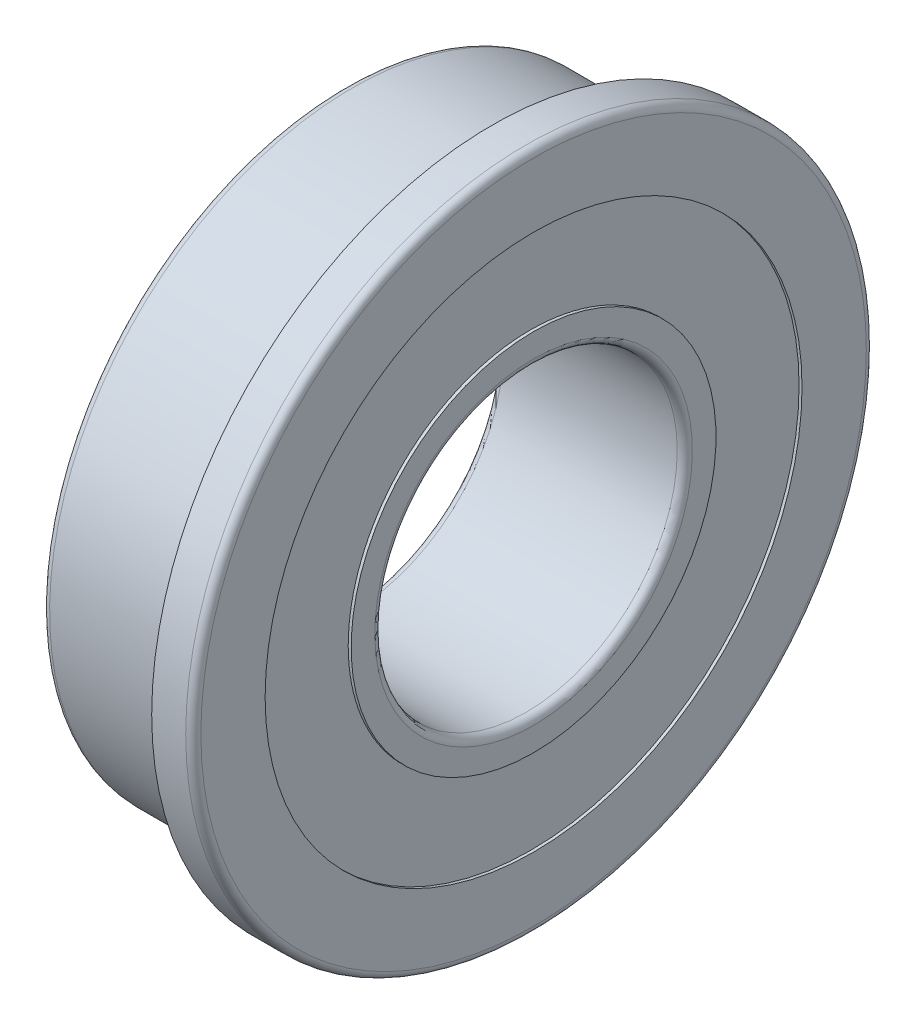
ISO-10303-21;
HEADER;
FILE_DESCRIPTION(('STEP AP214'),'2;1');
FILE_NAME('part.step','',(''),(''),'','','');
FILE_SCHEMA(('AUTOMOTIVE_DESIGN { 1 0 10303 214 1 1 1 1 }'));
ENDSEC;
DATA;
#1=APPLICATION_CONTEXT('core data for automotive mechanical design processes');
#2=APPLICATION_PROTOCOL_DEFINITION('international standard','automotive_design',2000,#1);
#3=PRODUCT_CONTEXT('',#1,'mechanical');
#4=PRODUCT('Part','Part','',(#3));
#5=PRODUCT_RELATED_PRODUCT_CATEGORY('part','',(#4));
#6=PRODUCT_DEFINITION_FORMATION('','',#4);
#7=PRODUCT_DEFINITION_CONTEXT('part definition',#1,'design');
#8=PRODUCT_DEFINITION('design','',#6,#7);
#9=PRODUCT_DEFINITION_SHAPE('','',#8);
#10=(LENGTH_UNIT() NAMED_UNIT(*) SI_UNIT(.MILLI.,.METRE.));
#11=(NAMED_UNIT(*) PLANE_ANGLE_UNIT() SI_UNIT($,.RADIAN.));
#12=(NAMED_UNIT(*) SI_UNIT($,.STERADIAN.) SOLID_ANGLE_UNIT());
#13=UNCERTAINTY_MEASURE_WITH_UNIT(LENGTH_MEASURE(1.E-05),#10,'distance_accuracy_value','');
#14=(GEOMETRIC_REPRESENTATION_CONTEXT(3) GLOBAL_UNCERTAINTY_ASSIGNED_CONTEXT((#13)) GLOBAL_UNIT_ASSIGNED_CONTEXT((#10,
#11,#12)) REPRESENTATION_CONTEXT('',''));
#15=CARTESIAN_POINT('',(0.,0.,0.));
#16=DIRECTION('',(0.,0.,1.));
#17=DIRECTION('',(1.,0.,0.));
#18=AXIS2_PLACEMENT_3D('',#15,#16,#17);
#19=CARTESIAN_POINT('',(4.6875,7.1,0.));
#20=DIRECTION('',(-1.,0.,0.));
#21=DIRECTION('',(0.,0.,1.));
#22=AXIS2_PLACEMENT_3D('',#19,#20,#21);
#23=PLANE('',#22);
#24=CARTESIAN_POINT('',(4.6875,0.,0.));
#25=DIRECTION('',(1.,0.,0.));
#26=DIRECTION('',(0.,0.,-1.));
#27=AXIS2_PLACEMENT_3D('',#24,#25,#26);
#28=CIRCLE('',#27,4.825);
#29=CARTESIAN_POINT('',(4.6875,0.,-4.825));
#30=VERTEX_POINT('',#29);
#31=EDGE_CURVE('P0_E10',#30,#30,#28,.T.);
#32=ORIENTED_EDGE('',*,*,#31,.T.);
#33=EDGE_LOOP('',(#32));
#34=FACE_BOUND('',#33,.T.);
#35=CARTESIAN_POINT('',(4.6875,0.,0.));
#36=DIRECTION('',(1.,0.,0.));
#37=DIRECTION('',(0.,0.,-1.));
#38=AXIS2_PLACEMENT_3D('',#35,#36,#37);
#39=CIRCLE('',#38,7.1);
#40=CARTESIAN_POINT('',(4.6875,0.,-7.1));
#41=VERTEX_POINT('',#40);
#42=EDGE_CURVE('P0_E23',#41,#41,#39,.T.);
#43=ORIENTED_EDGE('',*,*,#42,.F.);
#44=EDGE_LOOP('',(#43));
#45=FACE_BOUND('',#44,.T.);
#46=ADVANCED_FACE('P0_F15',(#34,#45),#23,.T.);
#47=CARTESIAN_POINT('',(4.92175,0.,0.));
#48=DIRECTION('',(1.,0.,0.));
#49=DIRECTION('',(0.,0.,-1.));
#50=AXIS2_PLACEMENT_3D('',#47,#48,#49);
#51=CYLINDRICAL_SURFACE('',#50,7.1);
#52=ORIENTED_EDGE('',*,*,#42,.T.);
#53=EDGE_LOOP('',(#52));
#54=FACE_BOUND('',#53,.T.);
#55=CARTESIAN_POINT('',(4.92175,0.,0.));
#56=DIRECTION('',(1.,0.,0.));
#57=DIRECTION('',(0.,0.,-1.));
#58=AXIS2_PLACEMENT_3D('',#55,#56,#57);
#59=CIRCLE('',#58,7.1);
#60=CARTESIAN_POINT('',(4.92175,0.,-7.1));
#61=VERTEX_POINT('',#60);
#62=EDGE_CURVE('P0_E41',#61,#61,#59,.T.);
#63=ORIENTED_EDGE('',*,*,#62,.F.);
#64=EDGE_LOOP('',(#63));
#65=FACE_BOUND('',#64,.T.);
#66=ADVANCED_FACE('P0_F53',(#54,#65),#51,.T.);
#67=CARTESIAN_POINT('',(4.92175,4.825,0.));
#68=DIRECTION('',(1.,0.,0.));
#69=DIRECTION('',(0.,0.,-1.));
#70=AXIS2_PLACEMENT_3D('',#67,#68,#69);
#71=PLANE('',#70);
#72=ORIENTED_EDGE('',*,*,#62,.T.);
#73=EDGE_LOOP('',(#72));
#74=FACE_BOUND('',#73,.T.);
#75=CARTESIAN_POINT('',(4.92175,0.,0.));
#76=DIRECTION('',(1.,0.,0.));
#77=DIRECTION('',(0.,0.,-1.));
#78=AXIS2_PLACEMENT_3D('',#75,#76,#77);
#79=CIRCLE('',#78,4.825);
#80=CARTESIAN_POINT('',(4.92175,0.,-4.825));
#81=VERTEX_POINT('',#80);
#82=EDGE_CURVE('P0_E38',#81,#81,#79,.T.);
#83=ORIENTED_EDGE('',*,*,#82,.F.);
#84=EDGE_LOOP('',(#83));
#85=FACE_BOUND('',#84,.T.);
#86=ADVANCED_FACE('P0_F39',(#74,#85),#71,.T.);
#87=CARTESIAN_POINT('',(4.92175,0.,0.));
#88=DIRECTION('',(1.,0.,0.));
#89=DIRECTION('',(0.,0.,-1.));
#90=AXIS2_PLACEMENT_3D('',#87,#88,#89);
#91=CYLINDRICAL_SURFACE('',#90,4.825);
#92=ORIENTED_EDGE('',*,*,#82,.T.);
#93=EDGE_LOOP('',(#92));
#94=FACE_BOUND('',#93,.T.);
#95=ORIENTED_EDGE('',*,*,#31,.F.);
#96=EDGE_LOOP('',(#95));
#97=FACE_BOUND('',#96,.T.);
#98=ADVANCED_FACE('P0_F58',(#94,#97),#91,.F.);
#99=CLOSED_SHELL('',(#46,#66,#86,#98));
#100=MANIFOLD_SOLID_BREP('P0_B1',#99);
#101=CARTESIAN_POINT('',(0.3125,0.,-7.1));
#102=DIRECTION('',(1.,0.,0.));
#103=DIRECTION('',(0.,-1.,0.));
#104=AXIS2_PLACEMENT_3D('',#101,#102,#103);
#105=PLANE('',#104);
#106=CARTESIAN_POINT('',(0.3125,0.,0.));
#107=DIRECTION('',(-1.,0.,0.));
#108=DIRECTION('',(0.,1.,0.));
#109=AXIS2_PLACEMENT_3D('',#106,#107,#108);
#110=CIRCLE('',#109,4.825);
#111=CARTESIAN_POINT('',(0.3125,4.825,0.));
#112=VERTEX_POINT('',#111);
#113=EDGE_CURVE('P1_E11',#112,#112,#110,.T.);
#114=ORIENTED_EDGE('',*,*,#113,.T.);
#115=EDGE_LOOP('',(#114));
#116=FACE_BOUND('',#115,.T.);
#117=CARTESIAN_POINT('',(0.3125,0.,0.));
#118=DIRECTION('',(-1.,0.,0.));
#119=DIRECTION('',(0.,1.,0.));
#120=AXIS2_PLACEMENT_3D('',#117,#118,#119);
#121=CIRCLE('',#120,7.1);
#122=CARTESIAN_POINT('',(0.3125,7.1,0.));
#123=VERTEX_POINT('',#122);
#124=EDGE_CURVE('P1_E24',#123,#123,#121,.T.);
#125=ORIENTED_EDGE('',*,*,#124,.F.);
#126=EDGE_LOOP('',(#125));
#127=FACE_BOUND('',#126,.T.);
#128=ADVANCED_FACE('P1_F16',(#116,#127),#105,.T.);
#129=CARTESIAN_POINT('',(0.07825,0.,0.));
#130=DIRECTION('',(-1.,0.,0.));
#131=DIRECTION('',(0.,1.,0.));
#132=AXIS2_PLACEMENT_3D('',#129,#130,#131);
#133=CYLINDRICAL_SURFACE('',#132,7.1);
#134=ORIENTED_EDGE('',*,*,#124,.T.);
#135=EDGE_LOOP('',(#134));
#136=FACE_BOUND('',#135,.T.);
#137=CARTESIAN_POINT('',(0.07825,0.,0.));
#138=DIRECTION('',(-1.,0.,0.));
#139=DIRECTION('',(0.,1.,0.));
#140=AXIS2_PLACEMENT_3D('',#137,#138,#139);
#141=CIRCLE('',#140,7.1);
#142=CARTESIAN_POINT('',(0.07825,7.1,0.));
#143=VERTEX_POINT('',#142);
#144=EDGE_CURVE('P1_E42',#143,#143,#141,.T.);
#145=ORIENTED_EDGE('',*,*,#144,.F.);
#146=EDGE_LOOP('',(#145));
#147=FACE_BOUND('',#146,.T.);
#148=ADVANCED_FACE('P1_F54',(#136,#147),#133,.T.);
#149=CARTESIAN_POINT('',(0.07825,0.,-4.825));
#150=DIRECTION('',(-1.,0.,0.));
#151=DIRECTION('',(0.,1.,0.));
#152=AXIS2_PLACEMENT_3D('',#149,#150,#151);
#153=PLANE('',#152);
#154=ORIENTED_EDGE('',*,*,#144,.T.);
#155=EDGE_LOOP('',(#154));
#156=FACE_BOUND('',#155,.T.);
#157=CARTESIAN_POINT('',(0.07825,0.,0.));
#158=DIRECTION('',(-1.,0.,0.));
#159=DIRECTION('',(0.,1.,0.));
#160=AXIS2_PLACEMENT_3D('',#157,#158,#159);
#161=CIRCLE('',#160,4.825);
#162=CARTESIAN_POINT('',(0.07825,4.825,0.));
#163=VERTEX_POINT('',#162);
#164=EDGE_CURVE('P1_E39',#163,#163,#161,.T.);
#165=ORIENTED_EDGE('',*,*,#164,.F.);
#166=EDGE_LOOP('',(#165));
#167=FACE_BOUND('',#166,.T.);
#168=ADVANCED_FACE('P1_F40',(#156,#167),#153,.T.);
#169=CARTESIAN_POINT('',(0.07825,0.,0.));
#170=DIRECTION('',(-1.,0.,0.));
#171=DIRECTION('',(0.,1.,0.));
#172=AXIS2_PLACEMENT_3D('',#169,#170,#171);
#173=CYLINDRICAL_SURFACE('',#172,4.825);
#174=ORIENTED_EDGE('',*,*,#164,.T.);
#175=EDGE_LOOP('',(#174));
#176=FACE_BOUND('',#175,.T.);
#177=ORIENTED_EDGE('',*,*,#113,.F.);
#178=EDGE_LOOP('',(#177));
#179=FACE_BOUND('',#178,.T.);
#180=ADVANCED_FACE('P1_F59',(#176,#179),#173,.F.);
#181=CLOSED_SHELL('',(#128,#148,#168,#180));
#182=MANIFOLD_SOLID_BREP('P1_B1',#181);
#183=CARTESIAN_POINT('',(0.,7.8,0.));
#184=DIRECTION('',(-1.,0.,0.));
#185=DIRECTION('',(0.,0.,1.));
#186=AXIS2_PLACEMENT_3D('',#183,#184,#185);
#187=PLANE('',#186);
#188=CARTESIAN_POINT('',(0.,0.,0.));
#189=DIRECTION('',(1.,0.,0.));
#190=DIRECTION('',(0.,0.,-1.));
#191=AXIS2_PLACEMENT_3D('',#188,#189,#190);
#192=CIRCLE('',#191,7.1);
#193=CARTESIAN_POINT('',(0.,0.,-7.1));
#194=VERTEX_POINT('',#193);
#195=EDGE_CURVE('P2_E11',#194,#194,#192,.T.);
#196=ORIENTED_EDGE('',*,*,#195,.T.);
#197=EDGE_LOOP('',(#196));
#198=FACE_BOUND('',#197,.T.);
#199=CARTESIAN_POINT('',(0.,0.,0.));
#200=DIRECTION('',(1.,0.,0.));
#201=DIRECTION('',(0.,0.,-1.));
#202=AXIS2_PLACEMENT_3D('',#199,#200,#201);
#203=CIRCLE('',#202,7.8);
#204=CARTESIAN_POINT('',(0.,-4.58472496788129,6.31033255612459));
#205=VERTEX_POINT('',#204);
#206=CARTESIAN_POINT('',(0.,0.,-7.8));
#207=VERTEX_POINT('',#206);
#208=EDGE_CURVE('P2_E24',#205,#207,#203,.T.);
#209=ORIENTED_EDGE('',*,*,#208,.F.);
#210=CARTESIAN_POINT('',(0.,0.,0.));
#211=DIRECTION('',(1.,0.,0.));
#212=DIRECTION('',(0.,0.,-1.));
#213=AXIS2_PLACEMENT_3D('',#210,#211,#212);
#214=CIRCLE('',#213,7.8);
#215=CARTESIAN_POINT('',(0.,7.4182408271022,2.41033255612459));
#216=VERTEX_POINT('',#215);
#217=EDGE_CURVE('P2_E221',#216,#205,#214,.T.);
#218=ORIENTED_EDGE('',*,*,#217,.F.);
#219=CARTESIAN_POINT('',(0.,0.,0.));
#220=DIRECTION('',(1.,0.,0.));
#221=DIRECTION('',(0.,0.,-1.));
#222=AXIS2_PLACEMENT_3D('',#219,#220,#221);
#223=CIRCLE('',#222,7.8);
#224=EDGE_CURVE('P2_E216',#207,#216,#223,.T.);
#225=ORIENTED_EDGE('',*,*,#224,.F.);
#226=EDGE_LOOP('',(#209,#218,#225));
#227=FACE_BOUND('',#226,.T.);
#228=ADVANCED_FACE('P2_F16',(#198,#227),#187,.T.);
#229=CARTESIAN_POINT('',(0.200000000000015,0.,0.));
#230=DIRECTION('',(1.,0.,0.));
#231=DIRECTION('',(0.,-0.587785252292473,0.809016994374948));
#232=AXIS2_PLACEMENT_3D('',#229,#230,#231);
#233=TOROIDAL_SURFACE('',#232,7.8,0.200000000000014);
#234=ORIENTED_EDGE('',*,*,#224,.T.);
#235=ORIENTED_EDGE('',*,*,#217,.T.);
#236=ORIENTED_EDGE('',*,*,#208,.T.);
#237=EDGE_LOOP('',(#234,#235,#236));
#238=FACE_BOUND('',#237,.T.);
#239=CARTESIAN_POINT('',(0.2,0.,0.));
#240=DIRECTION('',(1.,0.,0.));
#241=DIRECTION('',(0.,0.,-1.));
#242=AXIS2_PLACEMENT_3D('',#239,#240,#241);
#243=CIRCLE('',#242,8.);
#244=CARTESIAN_POINT('',(0.2,7.60845213036124,2.47213595499958));
#245=VERTEX_POINT('',#244);
#246=CARTESIAN_POINT('',(0.199999999999999,-4.70228201833979,6.47213595499959));
#247=VERTEX_POINT('',#246);
#248=EDGE_CURVE('P2_E211',#245,#247,#243,.T.);
#249=ORIENTED_EDGE('',*,*,#248,.F.);
#250=CARTESIAN_POINT('',(0.2,0.,0.));
#251=DIRECTION('',(1.,0.,0.));
#252=DIRECTION('',(0.,0.,-1.));
#253=AXIS2_PLACEMENT_3D('',#250,#251,#252);
#254=CIRCLE('',#253,8.);
#255=CARTESIAN_POINT('',(0.2,0.,-8.));
#256=VERTEX_POINT('',#255);
#257=EDGE_CURVE('P2_E206',#256,#245,#254,.T.);
#258=ORIENTED_EDGE('',*,*,#257,.F.);
#259=CARTESIAN_POINT('',(0.2,0.,0.));
#260=DIRECTION('',(1.,0.,0.));
#261=DIRECTION('',(0.,0.,-1.));
#262=AXIS2_PLACEMENT_3D('',#259,#260,#261);
#263=CIRCLE('',#262,8.);
#264=EDGE_CURVE('P2_E201',#247,#256,#263,.T.);
#265=ORIENTED_EDGE('',*,*,#264,.F.);
#266=EDGE_LOOP('',(#249,#258,#265));
#267=FACE_BOUND('',#266,.T.);
#268=ADVANCED_FACE('P2_F230',(#238,#267),#233,.T.);
#269=CARTESIAN_POINT('',(5.,0.,0.));
#270=DIRECTION('',(1.,0.,0.));
#271=DIRECTION('',(0.,0.,-1.));
#272=AXIS2_PLACEMENT_3D('',#269,#270,#271);
#273=CYLINDRICAL_SURFACE('',#272,8.);
#274=ORIENTED_EDGE('',*,*,#257,.T.);
#275=ORIENTED_EDGE('',*,*,#248,.T.);
#276=ORIENTED_EDGE('',*,*,#264,.T.);
#277=EDGE_LOOP('',(#274,#275,#276));
#278=FACE_BOUND('',#277,.T.);
#279=CARTESIAN_POINT('',(3.9,0.,0.));
#280=DIRECTION('',(1.,0.,0.));
#281=DIRECTION('',(0.,0.,-1.));
#282=AXIS2_PLACEMENT_3D('',#279,#280,#281);
#283=CIRCLE('',#282,8.);
#284=CARTESIAN_POINT('',(3.9,0.,-8.));
#285=VERTEX_POINT('',#284);
#286=EDGE_CURVE('P2_E196',#285,#285,#283,.T.);
#287=ORIENTED_EDGE('',*,*,#286,.F.);
#288=EDGE_LOOP('',(#287));
#289=FACE_BOUND('',#288,.T.);
#290=ADVANCED_FACE('P2_F237',(#278,#289),#273,.T.);
#291=CARTESIAN_POINT('',(3.9,9.,0.));
#292=DIRECTION('',(-1.,0.,0.));
#293=DIRECTION('',(0.,0.,1.));
#294=AXIS2_PLACEMENT_3D('',#291,#292,#293);
#295=PLANE('',#294);
#296=ORIENTED_EDGE('',*,*,#286,.T.);
#297=EDGE_LOOP('',(#296));
#298=FACE_BOUND('',#297,.T.);
#299=CARTESIAN_POINT('',(3.9,0.,0.));
#300=DIRECTION('',(1.,0.,0.));
#301=DIRECTION('',(0.,0.,-1.));
#302=AXIS2_PLACEMENT_3D('',#299,#300,#301);
#303=CIRCLE('',#302,9.);
#304=CARTESIAN_POINT('',(3.9,0.,-9.));
#305=VERTEX_POINT('',#304);
#306=EDGE_CURVE('P2_E191',#305,#305,#303,.T.);
#307=ORIENTED_EDGE('',*,*,#306,.F.);
#308=EDGE_LOOP('',(#307));
#309=FACE_BOUND('',#308,.T.);
#310=ADVANCED_FACE('P2_F241',(#298,#309),#295,.T.);
#311=CARTESIAN_POINT('',(5.,0.,0.));
#312=DIRECTION('',(1.,0.,0.));
#313=DIRECTION('',(0.,0.,-1.));
#314=AXIS2_PLACEMENT_3D('',#311,#312,#313);
#315=CYLINDRICAL_SURFACE('',#314,9.);
#316=ORIENTED_EDGE('',*,*,#306,.T.);
#317=EDGE_LOOP('',(#316));
#318=FACE_BOUND('',#317,.T.);
#319=CARTESIAN_POINT('',(4.8,0.,0.));
#320=DIRECTION('',(1.,0.,0.));
#321=DIRECTION('',(0.,0.,-1.));
#322=AXIS2_PLACEMENT_3D('',#319,#320,#321);
#323=CIRCLE('',#322,9.);
#324=CARTESIAN_POINT('',(4.8,-5.29006727063228,7.28115294937456));
#325=VERTEX_POINT('',#324);
#326=CARTESIAN_POINT('',(4.8,0.,-9.));
#327=VERTEX_POINT('',#326);
#328=EDGE_CURVE('P2_E186',#325,#327,#323,.T.);
#329=ORIENTED_EDGE('',*,*,#328,.F.);
#330=CARTESIAN_POINT('',(4.8,0.,0.));
#331=DIRECTION('',(1.,0.,0.));
#332=DIRECTION('',(0.,0.,-1.));
#333=AXIS2_PLACEMENT_3D('',#330,#331,#332);
#334=CIRCLE('',#333,9.);
#335=CARTESIAN_POINT('',(4.8,8.55950864665642,2.78115294937454));
#336=VERTEX_POINT('',#335);
#337=EDGE_CURVE('P2_E181',#336,#325,#334,.T.);
#338=ORIENTED_EDGE('',*,*,#337,.F.);
#339=CARTESIAN_POINT('',(4.8,0.,0.));
#340=DIRECTION('',(1.,0.,0.));
#341=DIRECTION('',(0.,0.,-1.));
#342=AXIS2_PLACEMENT_3D('',#339,#340,#341);
#343=CIRCLE('',#342,9.);
#344=EDGE_CURVE('P2_E176',#327,#336,#343,.T.);
#345=ORIENTED_EDGE('',*,*,#344,.F.);
#346=EDGE_LOOP('',(#329,#338,#345));
#347=FACE_BOUND('',#346,.T.);
#348=ADVANCED_FACE('P2_F247',(#318,#347),#315,.T.);
#349=CARTESIAN_POINT('',(4.8,0.,0.));
#350=DIRECTION('',(1.,0.,0.));
#351=DIRECTION('',(0.,-0.587785252292473,0.809016994374948));
#352=AXIS2_PLACEMENT_3D('',#349,#350,#351);
#353=TOROIDAL_SURFACE('',#352,8.8,0.200000000000034);
#354=ORIENTED_EDGE('',*,*,#344,.T.);
#355=ORIENTED_EDGE('',*,*,#337,.T.);
#356=ORIENTED_EDGE('',*,*,#328,.T.);
#357=EDGE_LOOP('',(#354,#355,#356));
#358=FACE_BOUND('',#357,.T.);
#359=CARTESIAN_POINT('',(5.,0.,0.));
#360=DIRECTION('',(1.,0.,0.));
#361=DIRECTION('',(0.,0.,-1.));
#362=AXIS2_PLACEMENT_3D('',#359,#360,#361);
#363=CIRCLE('',#362,8.8);
#364=CARTESIAN_POINT('',(5.00000000000003,8.36929734339735,2.71934955049954));
#365=VERTEX_POINT('',#364);
#366=CARTESIAN_POINT('',(5.00000000000003,-5.17251022017376,7.11934955049954));
#367=VERTEX_POINT('',#366);
#368=EDGE_CURVE('P2_E171',#365,#367,#363,.T.);
#369=ORIENTED_EDGE('',*,*,#368,.F.);
#370=CARTESIAN_POINT('',(5.,0.,0.));
#371=DIRECTION('',(1.,0.,0.));
#372=DIRECTION('',(0.,0.,-1.));
#373=AXIS2_PLACEMENT_3D('',#370,#371,#372);
#374=CIRCLE('',#373,8.8);
#375=CARTESIAN_POINT('',(5.,0.,-8.8));
#376=VERTEX_POINT('',#375);
#377=EDGE_CURVE('P2_E166',#376,#365,#374,.T.);
#378=ORIENTED_EDGE('',*,*,#377,.F.);
#379=CARTESIAN_POINT('',(5.,0.,0.));
#380=DIRECTION('',(1.,0.,0.));
#381=DIRECTION('',(0.,0.,-1.));
#382=AXIS2_PLACEMENT_3D('',#379,#380,#381);
#383=CIRCLE('',#382,8.8);
#384=EDGE_CURVE('P2_E161',#367,#376,#383,.T.);
#385=ORIENTED_EDGE('',*,*,#384,.F.);
#386=EDGE_LOOP('',(#369,#378,#385));
#387=FACE_BOUND('',#386,.T.);
#388=ADVANCED_FACE('P2_F251',(#358,#387),#353,.T.);
#389=CARTESIAN_POINT('',(5.,7.1,0.));
#390=DIRECTION('',(1.,0.,0.));
#391=DIRECTION('',(0.,0.,-1.));
#392=AXIS2_PLACEMENT_3D('',#389,#390,#391);
#393=PLANE('',#392);
#394=ORIENTED_EDGE('',*,*,#377,.T.);
#395=ORIENTED_EDGE('',*,*,#368,.T.);
#396=ORIENTED_EDGE('',*,*,#384,.T.);
#397=EDGE_LOOP('',(#394,#395,#396));
#398=FACE_BOUND('',#397,.T.);
#399=CARTESIAN_POINT('',(5.,0.,0.));
#400=DIRECTION('',(1.,0.,0.));
#401=DIRECTION('',(0.,0.,-1.));
#402=AXIS2_PLACEMENT_3D('',#399,#400,#401);
#403=CIRCLE('',#402,7.1);
#404=CARTESIAN_POINT('',(5.,0.,-7.1));
#405=VERTEX_POINT('',#404);
#406=EDGE_CURVE('P2_E156',#405,#405,#403,.T.);
#407=ORIENTED_EDGE('',*,*,#406,.F.);
#408=EDGE_LOOP('',(#407));
#409=FACE_BOUND('',#408,.T.);
#410=ADVANCED_FACE('P2_F255',(#398,#409),#393,.T.);
#411=CARTESIAN_POINT('',(5.,0.,0.));
#412=DIRECTION('',(1.,0.,0.));
#413=DIRECTION('',(0.,0.,-1.));
#414=AXIS2_PLACEMENT_3D('',#411,#412,#413);
#415=CYLINDRICAL_SURFACE('',#414,7.1);
#416=ORIENTED_EDGE('',*,*,#406,.T.);
#417=EDGE_LOOP('',(#416));
#418=FACE_BOUND('',#417,.T.);
#419=CARTESIAN_POINT('',(4.6875,0.,0.));
#420=DIRECTION('',(1.,0.,0.));
#421=DIRECTION('',(0.,0.,-1.));
#422=AXIS2_PLACEMENT_3D('',#419,#420,#421);
#423=CIRCLE('',#422,7.1);
#424=CARTESIAN_POINT('',(4.6875,0.,-7.1));
#425=VERTEX_POINT('',#424);
#426=EDGE_CURVE('P2_E151',#425,#425,#423,.T.);
#427=ORIENTED_EDGE('',*,*,#426,.F.);
#428=EDGE_LOOP('',(#427));
#429=FACE_BOUND('',#428,.T.);
#430=ADVANCED_FACE('P2_F259',(#418,#429),#415,.F.);
#431=CARTESIAN_POINT('',(4.6875,6.75,0.));
#432=DIRECTION('',(1.,0.,0.));
#433=DIRECTION('',(0.,0.,-1.));
#434=AXIS2_PLACEMENT_3D('',#431,#432,#433);
#435=PLANE('',#434);
#436=ORIENTED_EDGE('',*,*,#426,.T.);
#437=EDGE_LOOP('',(#436));
#438=FACE_BOUND('',#437,.T.);
#439=CARTESIAN_POINT('',(4.6875,0.,0.));
#440=DIRECTION('',(1.,0.,0.));
#441=DIRECTION('',(0.,0.,-1.));
#442=AXIS2_PLACEMENT_3D('',#439,#440,#441);
#443=CIRCLE('',#442,6.75);
#444=CARTESIAN_POINT('',(4.6875,0.,-6.75));
#445=VERTEX_POINT('',#444);
#446=EDGE_CURVE('P2_E146',#445,#445,#443,.T.);
#447=ORIENTED_EDGE('',*,*,#446,.F.);
#448=EDGE_LOOP('',(#447));
#449=FACE_BOUND('',#448,.T.);
#450=ADVANCED_FACE('P2_F263',(#438,#449),#435,.T.);
#451=CARTESIAN_POINT('',(5.,0.,0.));
#452=DIRECTION('',(1.,0.,0.));
#453=DIRECTION('',(0.,0.,-1.));
#454=AXIS2_PLACEMENT_3D('',#451,#452,#453);
#455=CYLINDRICAL_SURFACE('',#454,6.75);
#456=ORIENTED_EDGE('',*,*,#446,.T.);
#457=EDGE_LOOP('',(#456));
#458=FACE_BOUND('',#457,.T.);
#459=CARTESIAN_POINT('',(3.4367496997598,0.,0.));
#460=DIRECTION('',(1.,0.,0.));
#461=DIRECTION('',(0.,0.,-1.));
#462=AXIS2_PLACEMENT_3D('',#459,#460,#461);
#463=CIRCLE('',#462,6.75);
#464=CARTESIAN_POINT('',(3.4367496997598,-3.96755045297419,5.4608647120309));
#465=VERTEX_POINT('',#464);
#466=CARTESIAN_POINT('',(3.4367496997598,0.,-6.75));
#467=VERTEX_POINT('',#466);
#468=EDGE_CURVE('P2_E141',#465,#467,#463,.T.);
#469=ORIENTED_EDGE('',*,*,#468,.F.);
#470=CARTESIAN_POINT('',(3.4367496997598,0.,0.));
#471=DIRECTION('',(1.,0.,0.));
#472=DIRECTION('',(0.,0.,-1.));
#473=AXIS2_PLACEMENT_3D('',#470,#471,#472);
#474=CIRCLE('',#473,6.75);
#475=CARTESIAN_POINT('',(3.4367496997598,6.41963148499229,2.08586471203089));
#476=VERTEX_POINT('',#475);
#477=EDGE_CURVE('P2_E136',#476,#465,#474,.T.);
#478=ORIENTED_EDGE('',*,*,#477,.F.);
#479=CARTESIAN_POINT('',(3.4367496997598,0.,0.));
#480=DIRECTION('',(1.,0.,0.));
#481=DIRECTION('',(0.,0.,-1.));
#482=AXIS2_PLACEMENT_3D('',#479,#480,#481);
#483=CIRCLE('',#482,6.75);
#484=EDGE_CURVE('P2_E131',#467,#476,#483,.T.);
#485=ORIENTED_EDGE('',*,*,#484,.F.);
#486=EDGE_LOOP('',(#469,#478,#485));
#487=FACE_BOUND('',#486,.T.);
#488=ADVANCED_FACE('P2_F267',(#458,#487),#455,.F.);
#489=CARTESIAN_POINT('',(2.5,0.,0.));
#490=DIRECTION('',(1.,0.,0.));
#491=DIRECTION('',(0.,-0.587785252292473,0.809016994374948));
#492=AXIS2_PLACEMENT_3D('',#489,#490,#491);
#493=TOROIDAL_SURFACE('',#492,5.99999999999992,1.20000000000008);
#494=CARTESIAN_POINT('',(1.5632503002402,0.,0.));
#495=DIRECTION('',(1.,0.,0.));
#496=DIRECTION('',(0.,0.,-1.));
#497=AXIS2_PLACEMENT_3D('',#494,#495,#496);
#498=CIRCLE('',#497,6.75);
#499=CARTESIAN_POINT('',(1.5632503002402,-3.96755045297419,5.4608647120309));
#500=VERTEX_POINT('',#499);
#501=CARTESIAN_POINT('',(1.5632503002402,0.,-6.75));
#502=VERTEX_POINT('',#501);
#503=EDGE_CURVE('P2_E126',#500,#502,#498,.T.);
#504=ORIENTED_EDGE('',*,*,#503,.F.);
#505=CARTESIAN_POINT('',(1.5632503002402,0.,0.));
#506=DIRECTION('',(1.,0.,0.));
#507=DIRECTION('',(0.,0.,-1.));
#508=AXIS2_PLACEMENT_3D('',#505,#506,#507);
#509=CIRCLE('',#508,6.75);
#510=CARTESIAN_POINT('',(1.5632503002402,6.41963148499229,2.08586471203089));
#511=VERTEX_POINT('',#510);
#512=EDGE_CURVE('P2_E121',#511,#500,#509,.T.);
#513=ORIENTED_EDGE('',*,*,#512,.F.);
#514=CARTESIAN_POINT('',(1.5632503002402,0.,0.));
#515=DIRECTION('',(1.,0.,0.));
#516=DIRECTION('',(0.,0.,-1.));
#517=AXIS2_PLACEMENT_3D('',#514,#515,#516);
#518=CIRCLE('',#517,6.75);
#519=EDGE_CURVE('P2_E112',#502,#511,#518,.T.);
#520=ORIENTED_EDGE('',*,*,#519,.F.);
#521=EDGE_LOOP('',(#504,#513,#520));
#522=FACE_BOUND('',#521,.T.);
#523=ORIENTED_EDGE('',*,*,#468,.T.);
#524=ORIENTED_EDGE('',*,*,#484,.T.);
#525=ORIENTED_EDGE('',*,*,#477,.T.);
#526=EDGE_LOOP('',(#523,#524,#525));
#527=FACE_BOUND('',#526,.T.);
#528=ADVANCED_FACE('P2_F271',(#522,#527),#493,.F.);
#529=CARTESIAN_POINT('',(5.,0.,0.));
#530=DIRECTION('',(1.,0.,0.));
#531=DIRECTION('',(0.,0.,-1.));
#532=AXIS2_PLACEMENT_3D('',#529,#530,#531);
#533=CYLINDRICAL_SURFACE('',#532,6.75);
#534=ORIENTED_EDGE('',*,*,#519,.T.);
#535=ORIENTED_EDGE('',*,*,#512,.T.);
#536=ORIENTED_EDGE('',*,*,#503,.T.);
#537=EDGE_LOOP('',(#534,#535,#536));
#538=FACE_BOUND('',#537,.T.);
#539=CARTESIAN_POINT('',(0.3125,0.,0.));
#540=DIRECTION('',(1.,0.,0.));
#541=DIRECTION('',(0.,0.,-1.));
#542=AXIS2_PLACEMENT_3D('',#539,#540,#541);
#543=CIRCLE('',#542,6.75);
#544=CARTESIAN_POINT('',(0.3125,0.,-6.75));
#545=VERTEX_POINT('',#544);
#546=EDGE_CURVE('P2_E109',#545,#545,#543,.T.);
#547=ORIENTED_EDGE('',*,*,#546,.F.);
#548=EDGE_LOOP('',(#547));
#549=FACE_BOUND('',#548,.T.);
#550=ADVANCED_FACE('P2_F275',(#538,#549),#533,.F.);
#551=CARTESIAN_POINT('',(0.3125,7.1,0.));
#552=DIRECTION('',(-1.,0.,0.));
#553=DIRECTION('',(0.,0.,1.));
#554=AXIS2_PLACEMENT_3D('',#551,#552,#553);
#555=PLANE('',#554);
#556=ORIENTED_EDGE('',*,*,#546,.T.);
#557=EDGE_LOOP('',(#556));
#558=FACE_BOUND('',#557,.T.);
#559=CARTESIAN_POINT('',(0.3125,0.,0.));
#560=DIRECTION('',(1.,0.,0.));
#561=DIRECTION('',(0.,0.,-1.));
#562=AXIS2_PLACEMENT_3D('',#559,#560,#561);
#563=CIRCLE('',#562,7.1);
#564=CARTESIAN_POINT('',(0.3125,0.,-7.1));
#565=VERTEX_POINT('',#564);
#566=EDGE_CURVE('P2_E106',#565,#565,#563,.T.);
#567=ORIENTED_EDGE('',*,*,#566,.F.);
#568=EDGE_LOOP('',(#567));
#569=FACE_BOUND('',#568,.T.);
#570=ADVANCED_FACE('P2_F107',(#558,#569),#555,.T.);
#571=CARTESIAN_POINT('',(5.,0.,0.));
#572=DIRECTION('',(1.,0.,0.));
#573=DIRECTION('',(0.,0.,-1.));
#574=AXIS2_PLACEMENT_3D('',#571,#572,#573);
#575=CYLINDRICAL_SURFACE('',#574,7.1);
#576=ORIENTED_EDGE('',*,*,#566,.T.);
#577=EDGE_LOOP('',(#576));
#578=FACE_BOUND('',#577,.T.);
#579=ORIENTED_EDGE('',*,*,#195,.F.);
#580=EDGE_LOOP('',(#579));
#581=FACE_BOUND('',#580,.T.);
#582=ADVANCED_FACE('P2_F282',(#578,#581),#575,.F.);
#583=CLOSED_SHELL('',(#228,#268,#290,#310,#348,#388,#410,#430,#450,#488,#528,#550,#570,#582));
#584=MANIFOLD_SOLID_BREP('P2_B1',#583);
#585=CARTESIAN_POINT('',(0.,0.,4.825));
#586=DIRECTION('',(-1.,0.,0.));
#587=DIRECTION('',(0.,-1.,0.));
#588=AXIS2_PLACEMENT_3D('',#585,#586,#587);
#589=PLANE('',#588);
#590=CARTESIAN_POINT('',(0.,0.,0.));
#591=DIRECTION('',(1.,0.,0.));
#592=DIRECTION('',(0.,1.,0.));
#593=AXIS2_PLACEMENT_3D('',#590,#591,#592);
#594=CIRCLE('',#593,4.2);
#595=CARTESIAN_POINT('',(0.,4.2,0.));
#596=VERTEX_POINT('',#595);
#597=CARTESIAN_POINT('',(0.,-1.29787137637478,3.99443736843965));
#598=VERTEX_POINT('',#597);
#599=EDGE_CURVE('P3_E10',#596,#598,#594,.T.);
#600=ORIENTED_EDGE('',*,*,#599,.T.);
#601=CARTESIAN_POINT('',(0.,0.,0.));
#602=DIRECTION('',(1.,0.,0.));
#603=DIRECTION('',(0.,1.,0.));
#604=AXIS2_PLACEMENT_3D('',#601,#602,#603);
#605=CIRCLE('',#604,4.2);
#606=CARTESIAN_POINT('',(0.,-3.39787137637478,-2.46869805962839));
#607=VERTEX_POINT('',#606);
#608=EDGE_CURVE('P3_E23',#598,#607,#605,.T.);
#609=ORIENTED_EDGE('',*,*,#608,.T.);
#610=CARTESIAN_POINT('',(0.,0.,0.));
#611=DIRECTION('',(1.,0.,0.));
#612=DIRECTION('',(0.,1.,0.));
#613=AXIS2_PLACEMENT_3D('',#610,#611,#612);
#614=CIRCLE('',#613,4.2);
#615=EDGE_CURVE('P3_E203',#607,#596,#614,.T.);
#616=ORIENTED_EDGE('',*,*,#615,.T.);
#617=EDGE_LOOP('',(#600,#609,#616));
#618=FACE_BOUND('',#617,.T.);
#619=CARTESIAN_POINT('',(0.,0.,0.));
#620=DIRECTION('',(1.,0.,0.));
#621=DIRECTION('',(0.,1.,0.));
#622=AXIS2_PLACEMENT_3D('',#619,#620,#621);
#623=CIRCLE('',#622,4.825);
#624=CARTESIAN_POINT('',(0.,4.825,0.));
#625=VERTEX_POINT('',#624);
#626=EDGE_CURVE('P3_E198',#625,#625,#623,.T.);
#627=ORIENTED_EDGE('',*,*,#626,.F.);
#628=EDGE_LOOP('',(#627));
#629=FACE_BOUND('',#628,.T.);
#630=ADVANCED_FACE('P3_F15',(#618,#629),#589,.T.);
#631=CARTESIAN_POINT('',(5.,0.,0.));
#632=DIRECTION('',(1.,0.,0.));
#633=DIRECTION('',(0.,1.,0.));
#634=AXIS2_PLACEMENT_3D('',#631,#632,#633);
#635=CYLINDRICAL_SURFACE('',#634,4.825);
#636=ORIENTED_EDGE('',*,*,#626,.T.);
#637=EDGE_LOOP('',(#636));
#638=FACE_BOUND('',#637,.T.);
#639=CARTESIAN_POINT('',(0.3125,0.,0.));
#640=DIRECTION('',(1.,0.,0.));
#641=DIRECTION('',(0.,1.,0.));
#642=AXIS2_PLACEMENT_3D('',#639,#640,#641);
#643=CIRCLE('',#642,4.825);
#644=CARTESIAN_POINT('',(0.3125,4.825,0.));
#645=VERTEX_POINT('',#644);
#646=EDGE_CURVE('P3_E193',#645,#645,#643,.T.);
#647=ORIENTED_EDGE('',*,*,#646,.F.);
#648=EDGE_LOOP('',(#647));
#649=FACE_BOUND('',#648,.T.);
#650=ADVANCED_FACE('P3_F222',(#638,#649),#635,.T.);
#651=CARTESIAN_POINT('',(0.3125,0.,5.25));
#652=DIRECTION('',(-1.,0.,0.));
#653=DIRECTION('',(0.,-1.,0.));
#654=AXIS2_PLACEMENT_3D('',#651,#652,#653);
#655=PLANE('',#654);
#656=ORIENTED_EDGE('',*,*,#646,.T.);
#657=EDGE_LOOP('',(#656));
#658=FACE_BOUND('',#657,.T.);
#659=CARTESIAN_POINT('',(0.3125,0.,0.));
#660=DIRECTION('',(1.,0.,0.));
#661=DIRECTION('',(0.,1.,0.));
#662=AXIS2_PLACEMENT_3D('',#659,#660,#661);
#663=CIRCLE('',#662,5.25);
#664=CARTESIAN_POINT('',(0.3125,5.25,0.));
#665=VERTEX_POINT('',#664);
#666=EDGE_CURVE('P3_E188',#665,#665,#663,.T.);
#667=ORIENTED_EDGE('',*,*,#666,.F.);
#668=EDGE_LOOP('',(#667));
#669=FACE_BOUND('',#668,.T.);
#670=ADVANCED_FACE('P3_F226',(#658,#669),#655,.T.);
#671=CARTESIAN_POINT('',(5.,0.,0.));
#672=DIRECTION('',(1.,0.,0.));
#673=DIRECTION('',(0.,1.,0.));
#674=AXIS2_PLACEMENT_3D('',#671,#672,#673);
#675=CYLINDRICAL_SURFACE('',#674,5.25);
#676=ORIENTED_EDGE('',*,*,#666,.T.);
#677=EDGE_LOOP('',(#676));
#678=FACE_BOUND('',#677,.T.);
#679=CARTESIAN_POINT('',(1.5632503002402,0.,0.));
#680=DIRECTION('',(1.,0.,0.));
#681=DIRECTION('',(0.,1.,0.));
#682=AXIS2_PLACEMENT_3D('',#679,#680,#681);
#683=CIRCLE('',#682,5.25);
#684=CARTESIAN_POINT('',(1.5632503002402,-4.24733922046847,-3.08587257453548));
#685=VERTEX_POINT('',#684);
#686=CARTESIAN_POINT('',(1.5632503002402,5.25,0.));
#687=VERTEX_POINT('',#686);
#688=EDGE_CURVE('P3_E183',#685,#687,#683,.T.);
#689=ORIENTED_EDGE('',*,*,#688,.F.);
#690=CARTESIAN_POINT('',(1.5632503002402,0.,0.));
#691=DIRECTION('',(1.,0.,0.));
#692=DIRECTION('',(0.,1.,0.));
#693=AXIS2_PLACEMENT_3D('',#690,#691,#692);
#694=CIRCLE('',#693,5.25);
#695=CARTESIAN_POINT('',(1.5632503002402,-1.62233922046847,4.99304671054955));
#696=VERTEX_POINT('',#695);
#697=EDGE_CURVE('P3_E178',#696,#685,#694,.T.);
#698=ORIENTED_EDGE('',*,*,#697,.F.);
#699=CARTESIAN_POINT('',(1.5632503002402,0.,0.));
#700=DIRECTION('',(1.,0.,0.));
#701=DIRECTION('',(0.,1.,0.));
#702=AXIS2_PLACEMENT_3D('',#699,#700,#701);
#703=CIRCLE('',#702,5.25);
#704=EDGE_CURVE('P3_E173',#687,#696,#703,.T.);
#705=ORIENTED_EDGE('',*,*,#704,.F.);
#706=EDGE_LOOP('',(#689,#698,#705));
#707=FACE_BOUND('',#706,.T.);
#708=ADVANCED_FACE('P3_F231',(#678,#707),#675,.T.);
#709=CARTESIAN_POINT('',(2.5,0.,0.));
#710=DIRECTION('',(1.,0.,0.));
#711=DIRECTION('',(0.,-0.809016994374948,-0.587785252292473));
#712=AXIS2_PLACEMENT_3D('',#709,#710,#711);
#713=TOROIDAL_SURFACE('',#712,6.00000000000008,1.20000000000008);
#714=CARTESIAN_POINT('',(3.4367496997598,0.,0.));
#715=DIRECTION('',(1.,0.,0.));
#716=DIRECTION('',(0.,1.,0.));
#717=AXIS2_PLACEMENT_3D('',#714,#715,#716);
#718=CIRCLE('',#717,5.25);
#719=CARTESIAN_POINT('',(3.4367496997598,-4.24733922046847,-3.08587257453548));
#720=VERTEX_POINT('',#719);
#721=CARTESIAN_POINT('',(3.4367496997598,5.25,0.));
#722=VERTEX_POINT('',#721);
#723=EDGE_CURVE('P3_E168',#720,#722,#718,.T.);
#724=ORIENTED_EDGE('',*,*,#723,.F.);
#725=CARTESIAN_POINT('',(3.4367496997598,0.,0.));
#726=DIRECTION('',(1.,0.,0.));
#727=DIRECTION('',(0.,1.,0.));
#728=AXIS2_PLACEMENT_3D('',#725,#726,#727);
#729=CIRCLE('',#728,5.25);
#730=CARTESIAN_POINT('',(3.4367496997598,-1.62233922046847,4.99304671054956));
#731=VERTEX_POINT('',#730);
#732=EDGE_CURVE('P3_E163',#731,#720,#729,.T.);
#733=ORIENTED_EDGE('',*,*,#732,.F.);
#734=CARTESIAN_POINT('',(3.4367496997598,0.,0.));
#735=DIRECTION('',(1.,0.,0.));
#736=DIRECTION('',(0.,1.,0.));
#737=AXIS2_PLACEMENT_3D('',#734,#735,#736);
#738=CIRCLE('',#737,5.25);
#739=EDGE_CURVE('P3_E158',#722,#731,#738,.T.);
#740=ORIENTED_EDGE('',*,*,#739,.F.);
#741=EDGE_LOOP('',(#724,#733,#740));
#742=FACE_BOUND('',#741,.T.);
#743=ORIENTED_EDGE('',*,*,#688,.T.);
#744=ORIENTED_EDGE('',*,*,#704,.T.);
#745=ORIENTED_EDGE('',*,*,#697,.T.);
#746=EDGE_LOOP('',(#743,#744,#745));
#747=FACE_BOUND('',#746,.T.);
#748=ADVANCED_FACE('P3_F238',(#742,#747),#713,.F.);
#749=CARTESIAN_POINT('',(5.,0.,0.));
#750=DIRECTION('',(1.,0.,0.));
#751=DIRECTION('',(0.,1.,0.));
#752=AXIS2_PLACEMENT_3D('',#749,#750,#751);
#753=CYLINDRICAL_SURFACE('',#752,5.25);
#754=ORIENTED_EDGE('',*,*,#739,.T.);
#755=ORIENTED_EDGE('',*,*,#732,.T.);
#756=ORIENTED_EDGE('',*,*,#723,.T.);
#757=EDGE_LOOP('',(#754,#755,#756));
#758=FACE_BOUND('',#757,.T.);
#759=CARTESIAN_POINT('',(4.6875,0.,0.));
#760=DIRECTION('',(1.,0.,0.));
#761=DIRECTION('',(0.,1.,0.));
#762=AXIS2_PLACEMENT_3D('',#759,#760,#761);
#763=CIRCLE('',#762,5.25);
#764=CARTESIAN_POINT('',(4.6875,5.25,0.));
#765=VERTEX_POINT('',#764);
#766=EDGE_CURVE('P3_E153',#765,#765,#763,.T.);
#767=ORIENTED_EDGE('',*,*,#766,.F.);
#768=EDGE_LOOP('',(#767));
#769=FACE_BOUND('',#768,.T.);
#770=ADVANCED_FACE('P3_F242',(#758,#769),#753,.T.);
#771=CARTESIAN_POINT('',(4.6875,0.,4.825));
#772=DIRECTION('',(1.,0.,0.));
#773=DIRECTION('',(0.,1.,0.));
#774=AXIS2_PLACEMENT_3D('',#771,#772,#773);
#775=PLANE('',#774);
#776=ORIENTED_EDGE('',*,*,#766,.T.);
#777=EDGE_LOOP('',(#776));
#778=FACE_BOUND('',#777,.T.);
#779=CARTESIAN_POINT('',(4.6875,0.,0.));
#780=DIRECTION('',(1.,0.,0.));
#781=DIRECTION('',(0.,1.,0.));
#782=AXIS2_PLACEMENT_3D('',#779,#780,#781);
#783=CIRCLE('',#782,4.825);
#784=CARTESIAN_POINT('',(4.6875,4.825,0.));
#785=VERTEX_POINT('',#784);
#786=EDGE_CURVE('P3_E148',#785,#785,#783,.T.);
#787=ORIENTED_EDGE('',*,*,#786,.F.);
#788=EDGE_LOOP('',(#787));
#789=FACE_BOUND('',#788,.T.);
#790=ADVANCED_FACE('P3_F246',(#778,#789),#775,.T.);
#791=CARTESIAN_POINT('',(5.,0.,0.));
#792=DIRECTION('',(1.,0.,0.));
#793=DIRECTION('',(0.,1.,0.));
#794=AXIS2_PLACEMENT_3D('',#791,#792,#793);
#795=CYLINDRICAL_SURFACE('',#794,4.825);
#796=ORIENTED_EDGE('',*,*,#786,.T.);
#797=EDGE_LOOP('',(#796));
#798=FACE_BOUND('',#797,.T.);
#799=CARTESIAN_POINT('',(5.,0.,0.));
#800=DIRECTION('',(1.,0.,0.));
#801=DIRECTION('',(0.,1.,0.));
#802=AXIS2_PLACEMENT_3D('',#799,#800,#801);
#803=CIRCLE('',#802,4.825);
#804=CARTESIAN_POINT('',(5.,4.825,0.));
#805=VERTEX_POINT('',#804);
#806=EDGE_CURVE('P3_E143',#805,#805,#803,.T.);
#807=ORIENTED_EDGE('',*,*,#806,.F.);
#808=EDGE_LOOP('',(#807));
#809=FACE_BOUND('',#808,.T.);
#810=ADVANCED_FACE('P3_F250',(#798,#809),#795,.T.);
#811=CARTESIAN_POINT('',(5.,0.,4.2));
#812=DIRECTION('',(1.,0.,0.));
#813=DIRECTION('',(0.,1.,0.));
#814=AXIS2_PLACEMENT_3D('',#811,#812,#813);
#815=PLANE('',#814);
#816=ORIENTED_EDGE('',*,*,#806,.T.);
#817=EDGE_LOOP('',(#816));
#818=FACE_BOUND('',#817,.T.);
#819=CARTESIAN_POINT('',(5.,0.,0.));
#820=DIRECTION('',(1.,0.,0.));
#821=DIRECTION('',(0.,1.,0.));
#822=AXIS2_PLACEMENT_3D('',#819,#820,#821);
#823=CIRCLE('',#822,4.2);
#824=CARTESIAN_POINT('',(5.00000000000003,-3.39787137637478,-2.46869805962839));
#825=VERTEX_POINT('',#824);
#826=CARTESIAN_POINT('',(5.,4.2,0.));
#827=VERTEX_POINT('',#826);
#828=EDGE_CURVE('P3_E138',#825,#827,#823,.T.);
#829=ORIENTED_EDGE('',*,*,#828,.F.);
#830=CARTESIAN_POINT('',(5.,0.,0.));
#831=DIRECTION('',(1.,0.,0.));
#832=DIRECTION('',(0.,1.,0.));
#833=AXIS2_PLACEMENT_3D('',#830,#831,#832);
#834=CIRCLE('',#833,4.2);
#835=CARTESIAN_POINT('',(5.00000000000003,-1.29787137637478,3.99443736843965));
#836=VERTEX_POINT('',#835);
#837=EDGE_CURVE('P3_E133',#836,#825,#834,.T.);
#838=ORIENTED_EDGE('',*,*,#837,.F.);
#839=CARTESIAN_POINT('',(5.,0.,0.));
#840=DIRECTION('',(1.,0.,0.));
#841=DIRECTION('',(0.,1.,0.));
#842=AXIS2_PLACEMENT_3D('',#839,#840,#841);
#843=CIRCLE('',#842,4.2);
#844=EDGE_CURVE('P3_E128',#827,#836,#843,.T.);
#845=ORIENTED_EDGE('',*,*,#844,.F.);
#846=EDGE_LOOP('',(#829,#838,#845));
#847=FACE_BOUND('',#846,.T.);
#848=ADVANCED_FACE('P3_F254',(#818,#847),#815,.T.);
#849=CARTESIAN_POINT('',(4.8,0.,0.));
#850=DIRECTION('',(1.,0.,0.));
#851=DIRECTION('',(0.,-0.809016994374948,-0.587785252292473));
#852=AXIS2_PLACEMENT_3D('',#849,#850,#851);
#853=TOROIDAL_SURFACE('',#852,4.2,0.200000000000031);
#854=ORIENTED_EDGE('',*,*,#844,.T.);
#855=ORIENTED_EDGE('',*,*,#837,.T.);
#856=ORIENTED_EDGE('',*,*,#828,.T.);
#857=EDGE_LOOP('',(#854,#855,#856));
#858=FACE_BOUND('',#857,.T.);
#859=CARTESIAN_POINT('',(4.8,0.,0.));
#860=DIRECTION('',(1.,0.,0.));
#861=DIRECTION('',(0.,1.,0.));
#862=AXIS2_PLACEMENT_3D('',#859,#860,#861);
#863=CIRCLE('',#862,4.);
#864=CARTESIAN_POINT('',(4.8,-1.23606797749978,3.80422606518059));
#865=VERTEX_POINT('',#864);
#866=CARTESIAN_POINT('',(4.8,-3.23606797749977,-2.35114100916987));
#867=VERTEX_POINT('',#866);
#868=EDGE_CURVE('P3_E123',#865,#867,#863,.T.);
#869=ORIENTED_EDGE('',*,*,#868,.F.);
#870=CARTESIAN_POINT('',(4.8,0.,0.));
#871=DIRECTION('',(1.,0.,0.));
#872=DIRECTION('',(0.,1.,0.));
#873=AXIS2_PLACEMENT_3D('',#870,#871,#872);
#874=CIRCLE('',#873,4.);
#875=CARTESIAN_POINT('',(4.8,4.,0.));
#876=VERTEX_POINT('',#875);
#877=EDGE_CURVE('P3_E111',#876,#865,#874,.T.);
#878=ORIENTED_EDGE('',*,*,#877,.F.);
#879=CARTESIAN_POINT('',(4.8,0.,0.));
#880=DIRECTION('',(1.,0.,0.));
#881=DIRECTION('',(0.,1.,0.));
#882=AXIS2_PLACEMENT_3D('',#879,#880,#881);
#883=CIRCLE('',#882,4.);
#884=EDGE_CURVE('P3_E108',#867,#876,#883,.T.);
#885=ORIENTED_EDGE('',*,*,#884,.F.);
#886=EDGE_LOOP('',(#869,#878,#885));
#887=FACE_BOUND('',#886,.T.);
#888=ADVANCED_FACE('P3_F218',(#858,#887),#853,.T.);
#889=CARTESIAN_POINT('',(5.,0.,0.));
#890=DIRECTION('',(1.,0.,0.));
#891=DIRECTION('',(0.,1.,0.));
#892=AXIS2_PLACEMENT_3D('',#889,#890,#891);
#893=CYLINDRICAL_SURFACE('',#892,4.);
#894=ORIENTED_EDGE('',*,*,#877,.T.);
#895=ORIENTED_EDGE('',*,*,#868,.T.);
#896=ORIENTED_EDGE('',*,*,#884,.T.);
#897=EDGE_LOOP('',(#894,#895,#896));
#898=FACE_BOUND('',#897,.T.);
#899=CARTESIAN_POINT('',(0.2,0.,0.));
#900=DIRECTION('',(1.,0.,0.));
#901=DIRECTION('',(0.,1.,0.));
#902=AXIS2_PLACEMENT_3D('',#899,#900,#901);
#903=CIRCLE('',#902,4.);
#904=CARTESIAN_POINT('',(0.2,-3.23606797749978,-2.35114100916988));
#905=VERTEX_POINT('',#904);
#906=CARTESIAN_POINT('',(0.2,4.,0.));
#907=VERTEX_POINT('',#906);
#908=EDGE_CURVE('P3_E101',#905,#907,#903,.T.);
#909=ORIENTED_EDGE('',*,*,#908,.F.);
#910=CARTESIAN_POINT('',(0.2,0.,0.));
#911=DIRECTION('',(1.,0.,0.));
#912=DIRECTION('',(0.,1.,0.));
#913=AXIS2_PLACEMENT_3D('',#910,#911,#912);
#914=CIRCLE('',#913,4.);
#915=CARTESIAN_POINT('',(0.2,-1.23606797749978,3.8042260651806));
#916=VERTEX_POINT('',#915);
#917=EDGE_CURVE('P3_E103',#916,#905,#914,.T.);
#918=ORIENTED_EDGE('',*,*,#917,.F.);
#919=CARTESIAN_POINT('',(0.2,0.,0.));
#920=DIRECTION('',(1.,0.,0.));
#921=DIRECTION('',(0.,1.,0.));
#922=AXIS2_PLACEMENT_3D('',#919,#920,#921);
#923=CIRCLE('',#922,4.);
#924=EDGE_CURVE('P3_E98',#907,#916,#923,.T.);
#925=ORIENTED_EDGE('',*,*,#924,.F.);
#926=EDGE_LOOP('',(#909,#918,#925));
#927=FACE_BOUND('',#926,.T.);
#928=ADVANCED_FACE('P3_F100',(#898,#927),#893,.F.);
#929=CARTESIAN_POINT('',(0.200000000000014,0.,0.));
#930=DIRECTION('',(1.,0.,0.));
#931=DIRECTION('',(0.,-0.809016994374948,-0.587785252292473));
#932=AXIS2_PLACEMENT_3D('',#929,#930,#931);
#933=TOROIDAL_SURFACE('',#932,4.2,0.200000000000014);
#934=ORIENTED_EDGE('',*,*,#924,.T.);
#935=ORIENTED_EDGE('',*,*,#917,.T.);
#936=ORIENTED_EDGE('',*,*,#908,.T.);
#937=EDGE_LOOP('',(#934,#935,#936));
#938=FACE_BOUND('',#937,.T.);
#939=ORIENTED_EDGE('',*,*,#608,.F.);
#940=ORIENTED_EDGE('',*,*,#599,.F.);
#941=ORIENTED_EDGE('',*,*,#615,.F.);
#942=EDGE_LOOP('',(#939,#940,#941));
#943=FACE_BOUND('',#942,.T.);
#944=ADVANCED_FACE('P3_F106',(#938,#943),#933,.T.);
#945=CLOSED_SHELL('',(#630,#650,#670,#708,#748,#770,#790,#810,#848,#888,#928,#944));
#946=MANIFOLD_SOLID_BREP('P3_B1',#945);
#947=ADVANCED_BREP_SHAPE_REPRESENTATION('',(#18,#100,#182,#584,#946),#14);
#948=SHAPE_DEFINITION_REPRESENTATION(#9,#947);
ENDSEC;
END-ISO-10303-21;
